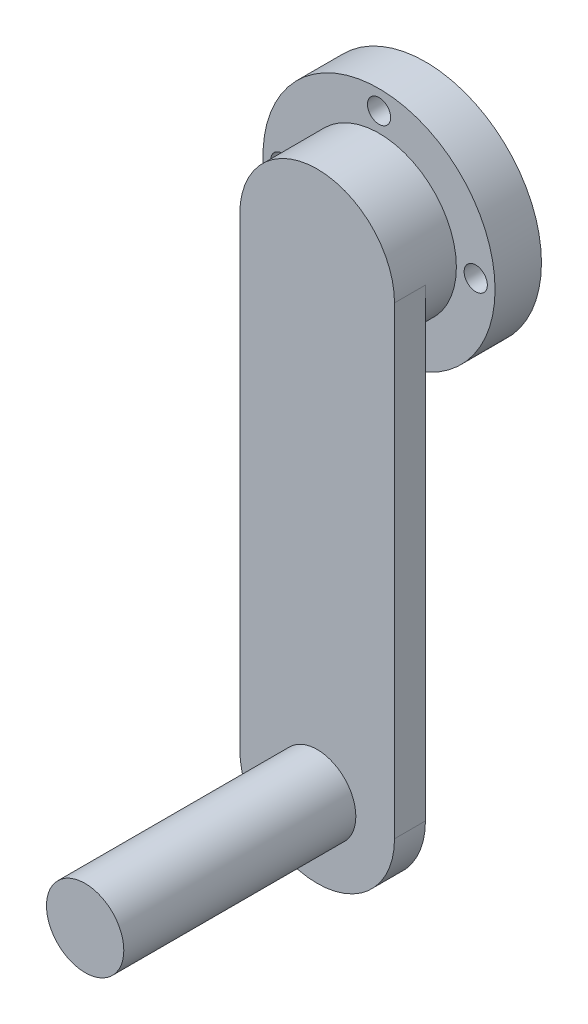
ISO-10303-21;
HEADER;
FILE_DESCRIPTION(('STEP AP214'),'2;1');
FILE_NAME('part.step','',(''),(''),'','','');
FILE_SCHEMA(('AUTOMOTIVE_DESIGN { 1 0 10303 214 1 1 1 1 }'));
ENDSEC;
DATA;
#1=APPLICATION_CONTEXT('core data for automotive mechanical design processes');
#2=APPLICATION_PROTOCOL_DEFINITION('international standard','automotive_design',2000,#1);
#3=PRODUCT_CONTEXT('',#1,'mechanical');
#4=PRODUCT('Part','Part','',(#3));
#5=PRODUCT_RELATED_PRODUCT_CATEGORY('part','',(#4));
#6=PRODUCT_DEFINITION_FORMATION('','',#4);
#7=PRODUCT_DEFINITION_CONTEXT('part definition',#1,'design');
#8=PRODUCT_DEFINITION('design','',#6,#7);
#9=PRODUCT_DEFINITION_SHAPE('','',#8);
#10=(LENGTH_UNIT() NAMED_UNIT(*) SI_UNIT(.MILLI.,.METRE.));
#11=(NAMED_UNIT(*) PLANE_ANGLE_UNIT() SI_UNIT($,.RADIAN.));
#12=(NAMED_UNIT(*) SI_UNIT($,.STERADIAN.) SOLID_ANGLE_UNIT());
#13=UNCERTAINTY_MEASURE_WITH_UNIT(LENGTH_MEASURE(1.E-05),#10,'distance_accuracy_value','');
#14=(GEOMETRIC_REPRESENTATION_CONTEXT(3) GLOBAL_UNCERTAINTY_ASSIGNED_CONTEXT((#13)) GLOBAL_UNIT_ASSIGNED_CONTEXT((#10,
#11,#12)) REPRESENTATION_CONTEXT('',''));
#15=CARTESIAN_POINT('',(0.,0.,0.));
#16=DIRECTION('',(0.,0.,1.));
#17=DIRECTION('',(1.,0.,0.));
#18=AXIS2_PLACEMENT_3D('',#15,#16,#17);
#19=CARTESIAN_POINT('',(0.,0.,6.));
#20=DIRECTION('',(0.,0.,1.));
#21=DIRECTION('',(1.,0.,0.));
#22=AXIS2_PLACEMENT_3D('',#19,#20,#21);
#23=PLANE('',#22);
#24=CARTESIAN_POINT('',(0.,0.,6.));
#25=DIRECTION('',(0.,0.,1.));
#26=DIRECTION('',(1.,0.,0.));
#27=AXIS2_PLACEMENT_3D('',#24,#25,#26);
#28=CIRCLE('',#27,10.);
#29=CARTESIAN_POINT('',(10.,0.,6.));
#30=VERTEX_POINT('',#29);
#31=EDGE_CURVE('E132',#30,#30,#28,.T.);
#32=ORIENTED_EDGE('',*,*,#31,.F.);
#33=EDGE_LOOP('',(#32));
#34=FACE_BOUND('',#33,.T.);
#35=CARTESIAN_POINT('',(3.50678942383248E-13,-12.5,6.));
#36=DIRECTION('',(0.,0.,1.));
#37=DIRECTION('',(1.,0.,0.));
#38=AXIS2_PLACEMENT_3D('',#35,#36,#37);
#39=CIRCLE('',#38,1.50000000000042);
#40=CARTESIAN_POINT('',(1.50000000000077,-12.5,6.));
#41=VERTEX_POINT('',#40);
#42=EDGE_CURVE('E147',#41,#41,#39,.T.);
#43=ORIENTED_EDGE('',*,*,#42,.F.);
#44=EDGE_LOOP('',(#43));
#45=FACE_BOUND('',#44,.T.);
#46=CARTESIAN_POINT('',(0.,12.5,6.));
#47=DIRECTION('',(0.,0.,1.));
#48=DIRECTION('',(1.,0.,0.));
#49=AXIS2_PLACEMENT_3D('',#46,#47,#48);
#50=CIRCLE('',#49,1.5);
#51=CARTESIAN_POINT('',(1.5,12.5,6.));
#52=VERTEX_POINT('',#51);
#53=EDGE_CURVE('E163',#52,#52,#50,.T.);
#54=ORIENTED_EDGE('',*,*,#53,.F.);
#55=EDGE_LOOP('',(#54));
#56=FACE_BOUND('',#55,.T.);
#57=CARTESIAN_POINT('',(0.,0.,6.));
#58=DIRECTION('',(0.,0.,1.));
#59=DIRECTION('',(1.,0.,0.));
#60=AXIS2_PLACEMENT_3D('',#57,#58,#59);
#61=CIRCLE('',#60,15.);
#62=CARTESIAN_POINT('',(15.,0.,6.));
#63=VERTEX_POINT('',#62);
#64=EDGE_CURVE('E11',#63,#63,#61,.T.);
#65=ORIENTED_EDGE('',*,*,#64,.T.);
#66=EDGE_LOOP('',(#65));
#67=FACE_BOUND('',#66,.T.);
#68=CARTESIAN_POINT('',(12.5,0.,6.));
#69=DIRECTION('',(0.,0.,1.));
#70=DIRECTION('',(1.,0.,0.));
#71=AXIS2_PLACEMENT_3D('',#68,#69,#70);
#72=CIRCLE('',#71,1.5);
#73=CARTESIAN_POINT('',(14.,0.,6.));
#74=VERTEX_POINT('',#73);
#75=EDGE_CURVE('E155',#74,#74,#72,.T.);
#76=ORIENTED_EDGE('',*,*,#75,.F.);
#77=EDGE_LOOP('',(#76));
#78=FACE_BOUND('',#77,.T.);
#79=CARTESIAN_POINT('',(-12.4999999999998,-1.76870279690558E-13,6.));
#80=DIRECTION('',(0.,0.,1.));
#81=DIRECTION('',(1.,0.,0.));
#82=AXIS2_PLACEMENT_3D('',#79,#80,#81);
#83=CIRCLE('',#82,1.50000000000034);
#84=CARTESIAN_POINT('',(-10.9999999999995,-1.76870279690558E-13,6.));
#85=VERTEX_POINT('',#84);
#86=EDGE_CURVE('E139',#85,#85,#83,.T.);
#87=ORIENTED_EDGE('',*,*,#86,.F.);
#88=EDGE_LOOP('',(#87));
#89=FACE_BOUND('',#88,.T.);
#90=ADVANCED_FACE('F43',(#34,#45,#56,#67,#78,#89),#23,.T.);
#91=CARTESIAN_POINT('',(0.,0.,0.));
#92=DIRECTION('',(0.,0.,1.));
#93=DIRECTION('',(1.,0.,0.));
#94=AXIS2_PLACEMENT_3D('',#91,#92,#93);
#95=PLANE('',#94);
#96=CARTESIAN_POINT('',(0.,0.,0.));
#97=DIRECTION('',(0.,0.,1.));
#98=DIRECTION('',(1.,0.,0.));
#99=AXIS2_PLACEMENT_3D('',#96,#97,#98);
#100=CIRCLE('',#99,15.);
#101=CARTESIAN_POINT('',(15.,0.,0.));
#102=VERTEX_POINT('',#101);
#103=EDGE_CURVE('E47',#102,#102,#100,.T.);
#104=ORIENTED_EDGE('',*,*,#103,.F.);
#105=EDGE_LOOP('',(#104));
#106=FACE_BOUND('',#105,.T.);
#107=CARTESIAN_POINT('',(0.,12.5,0.));
#108=DIRECTION('',(0.,0.,1.));
#109=DIRECTION('',(1.,0.,0.));
#110=AXIS2_PLACEMENT_3D('',#107,#108,#109);
#111=CIRCLE('',#110,1.5);
#112=CARTESIAN_POINT('',(1.5,12.5,0.));
#113=VERTEX_POINT('',#112);
#114=EDGE_CURVE('E159',#113,#113,#111,.T.);
#115=ORIENTED_EDGE('',*,*,#114,.T.);
#116=EDGE_LOOP('',(#115));
#117=FACE_BOUND('',#116,.T.);
#118=CARTESIAN_POINT('',(12.5,0.,0.));
#119=DIRECTION('',(0.,0.,1.));
#120=DIRECTION('',(1.,0.,0.));
#121=AXIS2_PLACEMENT_3D('',#118,#119,#120);
#122=CIRCLE('',#121,1.5);
#123=CARTESIAN_POINT('',(14.,0.,0.));
#124=VERTEX_POINT('',#123);
#125=EDGE_CURVE('E151',#124,#124,#122,.T.);
#126=ORIENTED_EDGE('',*,*,#125,.T.);
#127=EDGE_LOOP('',(#126));
#128=FACE_BOUND('',#127,.T.);
#129=CARTESIAN_POINT('',(3.50678942383248E-13,-12.5,0.));
#130=DIRECTION('',(0.,0.,1.));
#131=DIRECTION('',(1.,0.,0.));
#132=AXIS2_PLACEMENT_3D('',#129,#130,#131);
#133=CIRCLE('',#132,1.50000000000042);
#134=CARTESIAN_POINT('',(1.50000000000077,-12.5,0.));
#135=VERTEX_POINT('',#134);
#136=EDGE_CURVE('E143',#135,#135,#133,.T.);
#137=ORIENTED_EDGE('',*,*,#136,.T.);
#138=EDGE_LOOP('',(#137));
#139=FACE_BOUND('',#138,.T.);
#140=CARTESIAN_POINT('',(-12.4999999999998,-1.76870279690558E-13,0.));
#141=DIRECTION('',(0.,0.,1.));
#142=DIRECTION('',(1.,0.,0.));
#143=AXIS2_PLACEMENT_3D('',#140,#141,#142);
#144=CIRCLE('',#143,1.50000000000034);
#145=CARTESIAN_POINT('',(-10.9999999999995,-1.76870279690558E-13,0.));
#146=VERTEX_POINT('',#145);
#147=EDGE_CURVE('E135',#146,#146,#144,.T.);
#148=ORIENTED_EDGE('',*,*,#147,.T.);
#149=EDGE_LOOP('',(#148));
#150=FACE_BOUND('',#149,.T.);
#151=ADVANCED_FACE('F171',(#106,#117,#128,#139,#150),#95,.F.);
#152=CARTESIAN_POINT('',(0.,0.,6.));
#153=DIRECTION('',(0.,0.,-1.));
#154=DIRECTION('',(-1.,0.,0.));
#155=AXIS2_PLACEMENT_3D('',#152,#153,#154);
#156=CYLINDRICAL_SURFACE('',#155,15.);
#157=ORIENTED_EDGE('',*,*,#64,.F.);
#158=EDGE_LOOP('',(#157));
#159=FACE_BOUND('',#158,.T.);
#160=ORIENTED_EDGE('',*,*,#103,.T.);
#161=EDGE_LOOP('',(#160));
#162=FACE_BOUND('',#161,.T.);
#163=ADVANCED_FACE('F45',(#159,#162),#156,.T.);
#164=CARTESIAN_POINT('',(0.,12.5,6.));
#165=DIRECTION('',(0.,0.,-1.));
#166=DIRECTION('',(-1.,0.,0.));
#167=AXIS2_PLACEMENT_3D('',#164,#165,#166);
#168=CYLINDRICAL_SURFACE('',#167,1.5);
#169=ORIENTED_EDGE('',*,*,#53,.T.);
#170=EDGE_LOOP('',(#169));
#171=FACE_BOUND('',#170,.T.);
#172=ORIENTED_EDGE('',*,*,#114,.F.);
#173=EDGE_LOOP('',(#172));
#174=FACE_BOUND('',#173,.T.);
#175=ADVANCED_FACE('F174',(#171,#174),#168,.F.);
#176=CARTESIAN_POINT('',(12.5,0.,6.));
#177=DIRECTION('',(0.,0.,-1.));
#178=DIRECTION('',(-1.,0.,0.));
#179=AXIS2_PLACEMENT_3D('',#176,#177,#178);
#180=CYLINDRICAL_SURFACE('',#179,1.5);
#181=ORIENTED_EDGE('',*,*,#75,.T.);
#182=EDGE_LOOP('',(#181));
#183=FACE_BOUND('',#182,.T.);
#184=ORIENTED_EDGE('',*,*,#125,.F.);
#185=EDGE_LOOP('',(#184));
#186=FACE_BOUND('',#185,.T.);
#187=ADVANCED_FACE('F176',(#183,#186),#180,.F.);
#188=CARTESIAN_POINT('',(3.50678942383248E-13,-12.5,6.));
#189=DIRECTION('',(0.,0.,-1.));
#190=DIRECTION('',(-1.,0.,0.));
#191=AXIS2_PLACEMENT_3D('',#188,#189,#190);
#192=CYLINDRICAL_SURFACE('',#191,1.50000000000042);
#193=ORIENTED_EDGE('',*,*,#42,.T.);
#194=EDGE_LOOP('',(#193));
#195=FACE_BOUND('',#194,.T.);
#196=ORIENTED_EDGE('',*,*,#136,.F.);
#197=EDGE_LOOP('',(#196));
#198=FACE_BOUND('',#197,.T.);
#199=ADVANCED_FACE('F183',(#195,#198),#192,.F.);
#200=CARTESIAN_POINT('',(-12.4999999999998,-1.76870279690558E-13,6.));
#201=DIRECTION('',(0.,0.,-1.));
#202=DIRECTION('',(-1.,0.,0.));
#203=AXIS2_PLACEMENT_3D('',#200,#201,#202);
#204=CYLINDRICAL_SURFACE('',#203,1.50000000000034);
#205=ORIENTED_EDGE('',*,*,#86,.T.);
#206=EDGE_LOOP('',(#205));
#207=FACE_BOUND('',#206,.T.);
#208=ORIENTED_EDGE('',*,*,#147,.F.);
#209=EDGE_LOOP('',(#208));
#210=FACE_BOUND('',#209,.T.);
#211=ADVANCED_FACE('F206',(#207,#210),#204,.F.);
#212=CARTESIAN_POINT('',(0.,0.,10.));
#213=DIRECTION('',(0.,0.,-1.));
#214=DIRECTION('',(-1.,0.,0.));
#215=AXIS2_PLACEMENT_3D('',#212,#213,#214);
#216=CYLINDRICAL_SURFACE('',#215,10.);
#217=CARTESIAN_POINT('',(0.,0.,10.));
#218=DIRECTION('',(0.,0.,1.));
#219=DIRECTION('',(1.,0.,0.));
#220=AXIS2_PLACEMENT_3D('',#217,#218,#219);
#221=CIRCLE('',#220,10.);
#222=CARTESIAN_POINT('',(-10.,0.,10.));
#223=VERTEX_POINT('',#222);
#224=CARTESIAN_POINT('',(10.,0.,10.));
#225=VERTEX_POINT('',#224);
#226=EDGE_CURVE('E59',#223,#225,#221,.T.);
#227=ORIENTED_EDGE('',*,*,#226,.F.);
#228=DIRECTION('',(0.,0.,-1.));
#229=VECTOR('',#228,1.);
#230=CARTESIAN_POINT('',(-10.,0.,14.));
#231=LINE('',#230,#229);
#232=CARTESIAN_POINT('',(-10.,0.,14.));
#233=VERTEX_POINT('',#232);
#234=EDGE_CURVE('E106',#233,#223,#231,.T.);
#235=ORIENTED_EDGE('',*,*,#234,.F.);
#236=CARTESIAN_POINT('',(0.,0.,14.));
#237=DIRECTION('',(0.,0.,1.));
#238=DIRECTION('',(1.,0.,0.));
#239=AXIS2_PLACEMENT_3D('',#236,#237,#238);
#240=CIRCLE('',#239,10.);
#241=CARTESIAN_POINT('',(10.,0.,14.));
#242=VERTEX_POINT('',#241);
#243=EDGE_CURVE('E94',#242,#233,#240,.T.);
#244=ORIENTED_EDGE('',*,*,#243,.F.);
#245=DIRECTION('',(0.,0.,-1.));
#246=VECTOR('',#245,1.);
#247=CARTESIAN_POINT('',(10.,0.,14.));
#248=LINE('',#247,#246);
#249=EDGE_CURVE('E101',#242,#225,#248,.T.);
#250=ORIENTED_EDGE('',*,*,#249,.T.);
#251=EDGE_LOOP('',(#227,#235,#244,#250));
#252=FACE_BOUND('',#251,.T.);
#253=ORIENTED_EDGE('',*,*,#31,.T.);
#254=EDGE_LOOP('',(#253));
#255=FACE_BOUND('',#254,.T.);
#256=ADVANCED_FACE('F108',(#252,#255),#216,.T.);
#257=CARTESIAN_POINT('',(0.,-60.,10.));
#258=DIRECTION('',(0.,0.,1.));
#259=DIRECTION('',(1.,0.,0.));
#260=AXIS2_PLACEMENT_3D('',#257,#258,#259);
#261=PLANE('',#260);
#262=DIRECTION('',(0.,-1.,0.));
#263=VECTOR('',#262,1.);
#264=CARTESIAN_POINT('',(-10.,-60.,10.));
#265=LINE('',#264,#263);
#266=CARTESIAN_POINT('',(-10.,-60.,10.));
#267=VERTEX_POINT('',#266);
#268=EDGE_CURVE('E83',#223,#267,#265,.T.);
#269=ORIENTED_EDGE('',*,*,#268,.F.);
#270=ORIENTED_EDGE('',*,*,#226,.T.);
#271=DIRECTION('',(0.,1.,0.));
#272=VECTOR('',#271,1.);
#273=CARTESIAN_POINT('',(10.,-60.,10.));
#274=LINE('',#273,#272);
#275=CARTESIAN_POINT('',(10.,-60.,10.));
#276=VERTEX_POINT('',#275);
#277=EDGE_CURVE('E103',#276,#225,#274,.T.);
#278=ORIENTED_EDGE('',*,*,#277,.F.);
#279=CARTESIAN_POINT('',(0.,-60.,10.));
#280=DIRECTION('',(0.,0.,1.));
#281=DIRECTION('',(1.,0.,0.));
#282=AXIS2_PLACEMENT_3D('',#279,#280,#281);
#283=CIRCLE('',#282,10.);
#284=EDGE_CURVE('E117',#267,#276,#283,.T.);
#285=ORIENTED_EDGE('',*,*,#284,.F.);
#286=EDGE_LOOP('',(#269,#270,#278,#285));
#287=FACE_BOUND('',#286,.T.);
#288=ADVANCED_FACE('F216',(#287),#261,.F.);
#289=CARTESIAN_POINT('',(0.,-60.,14.));
#290=DIRECTION('',(0.,0.,-1.));
#291=DIRECTION('',(-1.,0.,0.));
#292=AXIS2_PLACEMENT_3D('',#289,#290,#291);
#293=CYLINDRICAL_SURFACE('',#292,10.);
#294=ORIENTED_EDGE('',*,*,#284,.T.);
#295=DIRECTION('',(0.,0.,-1.));
#296=VECTOR('',#295,1.);
#297=CARTESIAN_POINT('',(10.,-60.,14.));
#298=LINE('',#297,#296);
#299=CARTESIAN_POINT('',(10.,-60.,14.));
#300=VERTEX_POINT('',#299);
#301=EDGE_CURVE('E105',#300,#276,#298,.T.);
#302=ORIENTED_EDGE('',*,*,#301,.F.);
#303=CARTESIAN_POINT('',(0.,-60.,14.));
#304=DIRECTION('',(0.,0.,1.));
#305=DIRECTION('',(1.,0.,0.));
#306=AXIS2_PLACEMENT_3D('',#303,#304,#305);
#307=CIRCLE('',#306,10.);
#308=CARTESIAN_POINT('',(-10.,-60.,14.));
#309=VERTEX_POINT('',#308);
#310=EDGE_CURVE('E96',#309,#300,#307,.T.);
#311=ORIENTED_EDGE('',*,*,#310,.F.);
#312=DIRECTION('',(0.,0.,-1.));
#313=VECTOR('',#312,1.);
#314=CARTESIAN_POINT('',(-10.,-60.,14.));
#315=LINE('',#314,#313);
#316=EDGE_CURVE('E113',#309,#267,#315,.T.);
#317=ORIENTED_EDGE('',*,*,#316,.T.);
#318=EDGE_LOOP('',(#294,#302,#311,#317));
#319=FACE_BOUND('',#318,.T.);
#320=ADVANCED_FACE('F221',(#319),#293,.T.);
#321=CARTESIAN_POINT('',(10.,-60.,14.));
#322=DIRECTION('',(-1.,0.,0.));
#323=DIRECTION('',(0.,-1.,0.));
#324=AXIS2_PLACEMENT_3D('',#321,#322,#323);
#325=PLANE('',#324);
#326=ORIENTED_EDGE('',*,*,#277,.T.);
#327=ORIENTED_EDGE('',*,*,#249,.F.);
#328=DIRECTION('',(0.,1.,0.));
#329=VECTOR('',#328,1.);
#330=CARTESIAN_POINT('',(10.,-60.,14.));
#331=LINE('',#330,#329);
#332=EDGE_CURVE('E91',#300,#242,#331,.T.);
#333=ORIENTED_EDGE('',*,*,#332,.F.);
#334=ORIENTED_EDGE('',*,*,#301,.T.);
#335=EDGE_LOOP('',(#326,#327,#333,#334));
#336=FACE_BOUND('',#335,.T.);
#337=ADVANCED_FACE('F102',(#336),#325,.F.);
#338=CARTESIAN_POINT('',(-10.,-60.,14.));
#339=DIRECTION('',(1.,0.,0.));
#340=DIRECTION('',(0.,1.,0.));
#341=AXIS2_PLACEMENT_3D('',#338,#339,#340);
#342=PLANE('',#341);
#343=ORIENTED_EDGE('',*,*,#268,.T.);
#344=ORIENTED_EDGE('',*,*,#316,.F.);
#345=DIRECTION('',(0.,-1.,0.));
#346=VECTOR('',#345,1.);
#347=CARTESIAN_POINT('',(-10.,-60.,14.));
#348=LINE('',#347,#346);
#349=EDGE_CURVE('E68',#233,#309,#348,.T.);
#350=ORIENTED_EDGE('',*,*,#349,.F.);
#351=ORIENTED_EDGE('',*,*,#234,.T.);
#352=EDGE_LOOP('',(#343,#344,#350,#351));
#353=FACE_BOUND('',#352,.T.);
#354=ADVANCED_FACE('F227',(#353),#342,.F.);
#355=CARTESIAN_POINT('',(0.,-60.,14.));
#356=DIRECTION('',(0.,0.,1.));
#357=DIRECTION('',(1.,0.,0.));
#358=AXIS2_PLACEMENT_3D('',#355,#356,#357);
#359=PLANE('',#358);
#360=CARTESIAN_POINT('',(0.,-60.,14.));
#361=DIRECTION('',(0.,0.,1.));
#362=DIRECTION('',(1.,0.,0.));
#363=AXIS2_PLACEMENT_3D('',#360,#361,#362);
#364=CIRCLE('',#363,5.);
#365=CARTESIAN_POINT('',(5.,-60.,14.));
#366=VERTEX_POINT('',#365);
#367=EDGE_CURVE('E248',#366,#366,#364,.T.);
#368=ORIENTED_EDGE('',*,*,#367,.F.);
#369=EDGE_LOOP('',(#368));
#370=FACE_BOUND('',#369,.T.);
#371=ORIENTED_EDGE('',*,*,#310,.T.);
#372=ORIENTED_EDGE('',*,*,#332,.T.);
#373=ORIENTED_EDGE('',*,*,#243,.T.);
#374=ORIENTED_EDGE('',*,*,#349,.T.);
#375=EDGE_LOOP('',(#371,#372,#373,#374));
#376=FACE_BOUND('',#375,.T.);
#377=ADVANCED_FACE('F92',(#370,#376),#359,.T.);
#378=CARTESIAN_POINT('',(0.,-60.,44.));
#379=DIRECTION('',(0.,0.,-1.));
#380=DIRECTION('',(-1.,0.,0.));
#381=AXIS2_PLACEMENT_3D('',#378,#379,#380);
#382=CYLINDRICAL_SURFACE('',#381,5.);
#383=CARTESIAN_POINT('',(0.,-60.,44.));
#384=DIRECTION('',(0.,0.,1.));
#385=DIRECTION('',(1.,0.,0.));
#386=AXIS2_PLACEMENT_3D('',#383,#384,#385);
#387=CIRCLE('',#386,5.);
#388=CARTESIAN_POINT('',(5.,-60.,44.));
#389=VERTEX_POINT('',#388);
#390=EDGE_CURVE('E121',#389,#389,#387,.T.);
#391=ORIENTED_EDGE('',*,*,#390,.F.);
#392=EDGE_LOOP('',(#391));
#393=FACE_BOUND('',#392,.T.);
#394=ORIENTED_EDGE('',*,*,#367,.T.);
#395=EDGE_LOOP('',(#394));
#396=FACE_BOUND('',#395,.T.);
#397=ADVANCED_FACE('F235',(#393,#396),#382,.T.);
#398=CARTESIAN_POINT('',(0.,-60.,44.));
#399=DIRECTION('',(0.,0.,1.));
#400=DIRECTION('',(1.,0.,0.));
#401=AXIS2_PLACEMENT_3D('',#398,#399,#400);
#402=PLANE('',#401);
#403=ORIENTED_EDGE('',*,*,#390,.T.);
#404=EDGE_LOOP('',(#403));
#405=FACE_BOUND('',#404,.T.);
#406=ADVANCED_FACE('F239',(#405),#402,.T.);
#407=CLOSED_SHELL('',(#90,#151,#163,#175,#187,#199,#211,#256,#288,#320,#337,#354,#377,#397,#406));
#408=MANIFOLD_SOLID_BREP('B2',#407);
#409=ADVANCED_BREP_SHAPE_REPRESENTATION('',(#18,#408),#14);
#410=SHAPE_DEFINITION_REPRESENTATION(#9,#409);
ENDSEC;
END-ISO-10303-21;
